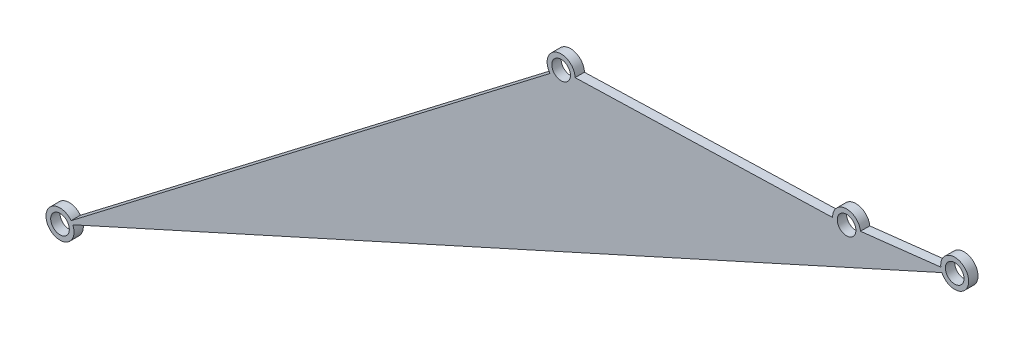
ISO-10303-21;
HEADER;
FILE_DESCRIPTION(('STEP AP214'),'2;1');
FILE_NAME('part.step','',(''),(''),'','','');
FILE_SCHEMA(('AUTOMOTIVE_DESIGN { 1 0 10303 214 1 1 1 1 }'));
ENDSEC;
DATA;
#1=APPLICATION_CONTEXT('core data for automotive mechanical design processes');
#2=APPLICATION_PROTOCOL_DEFINITION('international standard','automotive_design',2000,#1);
#3=PRODUCT_CONTEXT('',#1,'mechanical');
#4=PRODUCT('Part','Part','',(#3));
#5=PRODUCT_RELATED_PRODUCT_CATEGORY('part','',(#4));
#6=PRODUCT_DEFINITION_FORMATION('','',#4);
#7=PRODUCT_DEFINITION_CONTEXT('part definition',#1,'design');
#8=PRODUCT_DEFINITION('design','',#6,#7);
#9=PRODUCT_DEFINITION_SHAPE('','',#8);
#10=(LENGTH_UNIT() NAMED_UNIT(*) SI_UNIT(.MILLI.,.METRE.));
#11=(NAMED_UNIT(*) PLANE_ANGLE_UNIT() SI_UNIT($,.RADIAN.));
#12=(NAMED_UNIT(*) SI_UNIT($,.STERADIAN.) SOLID_ANGLE_UNIT());
#13=UNCERTAINTY_MEASURE_WITH_UNIT(LENGTH_MEASURE(1.E-05),#10,'distance_accuracy_value','');
#14=(GEOMETRIC_REPRESENTATION_CONTEXT(3) GLOBAL_UNCERTAINTY_ASSIGNED_CONTEXT((#13)) GLOBAL_UNIT_ASSIGNED_CONTEXT((#10,
#11,#12)) REPRESENTATION_CONTEXT('',''));
#15=CARTESIAN_POINT('',(0.,0.,0.));
#16=DIRECTION('',(0.,0.,1.));
#17=DIRECTION('',(1.,0.,0.));
#18=AXIS2_PLACEMENT_3D('',#15,#16,#17);
#19=CARTESIAN_POINT('',(50.8029772281827,18.0824154721674,1.));
#20=DIRECTION('',(0.,0.,1.));
#21=DIRECTION('',(1.,0.,0.));
#22=AXIS2_PLACEMENT_3D('',#19,#20,#21);
#23=PLANE('',#22);
#24=CARTESIAN_POINT('',(39.2074477952529,16.7661339027234,1.));
#25=DIRECTION('',(0.,0.,1.));
#26=DIRECTION('',(1.,0.,0.));
#27=AXIS2_PLACEMENT_3D('',#24,#25,#26);
#28=CIRCLE('',#27,0.999999999999998);
#29=CARTESIAN_POINT('',(40.2074477952529,16.7661339027234,1.));
#30=VERTEX_POINT('',#29);
#31=EDGE_CURVE('E195',#30,#30,#28,.T.);
#32=ORIENTED_EDGE('',*,*,#31,.F.);
#33=EDGE_LOOP('',(#32));
#34=FACE_BOUND('',#33,.T.);
#35=CARTESIAN_POINT('',(-45.1567950935448,-25.3229355339265,1.));
#36=DIRECTION('',(0.,0.,1.));
#37=DIRECTION('',(1.,0.,0.));
#38=AXIS2_PLACEMENT_3D('',#35,#36,#37);
#39=CIRCLE('',#38,0.999999999999998);
#40=CARTESIAN_POINT('',(-44.1567950935448,-25.3229355339265,1.));
#41=VERTEX_POINT('',#40);
#42=EDGE_CURVE('E141',#41,#41,#39,.T.);
#43=ORIENTED_EDGE('',*,*,#42,.F.);
#44=EDGE_LOOP('',(#43));
#45=FACE_BOUND('',#44,.T.);
#46=CARTESIAN_POINT('',(50.8029772281827,18.0824154721674,1.));
#47=DIRECTION('',(0.,0.,1.));
#48=DIRECTION('',(1.,0.,0.));
#49=AXIS2_PLACEMENT_3D('',#46,#47,#48);
#50=CIRCLE('',#49,1.50000000000001);
#51=CARTESIAN_POINT('',(49.4362884845197,17.4642230442417,1.));
#52=VERTEX_POINT('',#51);
#53=CARTESIAN_POINT('',(49.3125492805054,17.913227609771,1.));
#54=VERTEX_POINT('',#53);
#55=EDGE_CURVE('E152',#52,#54,#50,.T.);
#56=ORIENTED_EDGE('',*,*,#55,.T.);
#57=DIRECTION('',(-0.993618631784904,-0.112791908264269,0.));
#58=VECTOR('',#57,1.);
#59=CARTESIAN_POINT('',(40.6978757429303,16.9353217651198,1.));
#60=LINE('',#59,#58);
#61=CARTESIAN_POINT('',(40.6978757429303,16.9353217651198,1.));
#62=VERTEX_POINT('',#61);
#63=EDGE_CURVE('E100',#54,#62,#60,.T.);
#64=ORIENTED_EDGE('',*,*,#63,.T.);
#65=CARTESIAN_POINT('',(39.2074477952529,16.7661339027234,1.));
#66=DIRECTION('',(0.,0.,1.));
#67=DIRECTION('',(1.,0.,0.));
#68=AXIS2_PLACEMENT_3D('',#65,#66,#67);
#69=CIRCLE('',#68,1.50000000000001);
#70=CARTESIAN_POINT('',(37.708107977388,16.7216354694385,1.));
#71=VERTEX_POINT('',#70);
#72=EDGE_CURVE('E167',#62,#71,#69,.T.);
#73=ORIENTED_EDGE('',*,*,#72,.T.);
#74=DIRECTION('',(-0.999559878576607,-0.029665622189961,0.));
#75=VECTOR('',#74,1.);
#76=CARTESIAN_POINT('',(10.0902685323163,15.9019743283298,1.));
#77=LINE('',#76,#75);
#78=CARTESIAN_POINT('',(10.0902685323163,15.9019743283298,1.));
#79=VERTEX_POINT('',#78);
#80=EDGE_CURVE('E180',#71,#79,#77,.T.);
#81=ORIENTED_EDGE('',*,*,#80,.T.);
#82=CARTESIAN_POINT('',(8.59092871445141,15.8574758950449,1.));
#83=DIRECTION('',(0.,0.,1.));
#84=DIRECTION('',(1.,0.,0.));
#85=AXIS2_PLACEMENT_3D('',#82,#83,#84);
#86=CIRCLE('',#85,1.50000000000001);
#87=CARTESIAN_POINT('',(7.40023921936952,14.9451938518688,1.));
#88=VERTEX_POINT('',#87);
#89=EDGE_CURVE('E119',#79,#88,#86,.T.);
#90=ORIENTED_EDGE('',*,*,#89,.T.);
#91=DIRECTION('',(-0.793792996721256,-0.6081880287841,0.));
#92=VECTOR('',#91,1.);
#93=CARTESIAN_POINT('',(-43.9661055984629,-24.4106534907503,1.));
#94=LINE('',#93,#92);
#95=CARTESIAN_POINT('',(-43.9661055984629,-24.4106534907503,1.));
#96=VERTEX_POINT('',#95);
#97=EDGE_CURVE('E113',#88,#96,#94,.T.);
#98=ORIENTED_EDGE('',*,*,#97,.T.);
#99=CARTESIAN_POINT('',(-45.1567950935448,-25.3229355339265,1.));
#100=DIRECTION('',(0.,0.,1.));
#101=DIRECTION('',(1.,0.,0.));
#102=AXIS2_PLACEMENT_3D('',#99,#100,#101);
#103=CIRCLE('',#102,1.50000000000001);
#104=CARTESIAN_POINT('',(-43.7901063498818,-24.7047431060007,1.));
#105=VERTEX_POINT('',#104);
#106=EDGE_CURVE('E117',#96,#105,#103,.T.);
#107=ORIENTED_EDGE('',*,*,#106,.T.);
#108=DIRECTION('',(0.911125829108693,0.412128285283839,0.));
#109=VECTOR('',#108,1.);
#110=CARTESIAN_POINT('',(49.4362884845197,17.4642230442417,1.));
#111=LINE('',#110,#109);
#112=EDGE_CURVE('E57',#105,#52,#111,.T.);
#113=ORIENTED_EDGE('',*,*,#112,.T.);
#114=EDGE_LOOP('',(#56,#64,#73,#81,#90,#98,#107,#113));
#115=FACE_BOUND('',#114,.T.);
#116=CARTESIAN_POINT('',(8.59092871445141,15.8574758950449,1.));
#117=DIRECTION('',(0.,0.,1.));
#118=DIRECTION('',(1.,0.,0.));
#119=AXIS2_PLACEMENT_3D('',#116,#117,#118);
#120=CIRCLE('',#119,1.);
#121=CARTESIAN_POINT('',(9.59092871445141,15.8574758950449,1.));
#122=VERTEX_POINT('',#121);
#123=EDGE_CURVE('E189',#122,#122,#120,.T.);
#124=ORIENTED_EDGE('',*,*,#123,.F.);
#125=EDGE_LOOP('',(#124));
#126=FACE_BOUND('',#125,.T.);
#127=CARTESIAN_POINT('',(50.8029772281827,18.0824154721674,1.));
#128=DIRECTION('',(0.,0.,1.));
#129=DIRECTION('',(1.,0.,0.));
#130=AXIS2_PLACEMENT_3D('',#127,#128,#129);
#131=CIRCLE('',#130,0.999999999999998);
#132=CARTESIAN_POINT('',(51.8029772281827,18.0824154721674,1.));
#133=VERTEX_POINT('',#132);
#134=EDGE_CURVE('E201',#133,#133,#131,.T.);
#135=ORIENTED_EDGE('',*,*,#134,.F.);
#136=EDGE_LOOP('',(#135));
#137=FACE_BOUND('',#136,.T.);
#138=ADVANCED_FACE('F40',(#34,#45,#115,#126,#137),#23,.T.);
#139=CARTESIAN_POINT('',(50.8029772281827,18.0824154721674,0.));
#140=DIRECTION('',(0.,0.,1.));
#141=DIRECTION('',(1.,0.,0.));
#142=AXIS2_PLACEMENT_3D('',#139,#140,#141);
#143=PLANE('',#142);
#144=CARTESIAN_POINT('',(50.8029772281827,18.0824154721674,0.));
#145=DIRECTION('',(0.,0.,1.));
#146=DIRECTION('',(1.,0.,0.));
#147=AXIS2_PLACEMENT_3D('',#144,#145,#146);
#148=CIRCLE('',#147,1.50000000000001);
#149=CARTESIAN_POINT('',(49.4362884845197,17.4642230442417,0.));
#150=VERTEX_POINT('',#149);
#151=CARTESIAN_POINT('',(49.3125492805054,17.913227609771,0.));
#152=VERTEX_POINT('',#151);
#153=EDGE_CURVE('E137',#150,#152,#148,.T.);
#154=ORIENTED_EDGE('',*,*,#153,.F.);
#155=DIRECTION('',(0.911125829108693,0.412128285283839,0.));
#156=VECTOR('',#155,1.);
#157=CARTESIAN_POINT('',(49.4362884845197,17.4642230442417,0.));
#158=LINE('',#157,#156);
#159=CARTESIAN_POINT('',(-43.7901063498818,-24.7047431060007,0.));
#160=VERTEX_POINT('',#159);
#161=EDGE_CURVE('E92',#160,#150,#158,.T.);
#162=ORIENTED_EDGE('',*,*,#161,.F.);
#163=CARTESIAN_POINT('',(-45.1567950935448,-25.3229355339265,0.));
#164=DIRECTION('',(0.,0.,1.));
#165=DIRECTION('',(1.,0.,0.));
#166=AXIS2_PLACEMENT_3D('',#163,#164,#165);
#167=CIRCLE('',#166,1.50000000000001);
#168=CARTESIAN_POINT('',(-43.9661055984629,-24.4106534907503,0.));
#169=VERTEX_POINT('',#168);
#170=EDGE_CURVE('E86',#169,#160,#167,.T.);
#171=ORIENTED_EDGE('',*,*,#170,.F.);
#172=DIRECTION('',(-0.793792996721256,-0.6081880287841,0.));
#173=VECTOR('',#172,1.);
#174=CARTESIAN_POINT('',(-43.9661055984629,-24.4106534907503,0.));
#175=LINE('',#174,#173);
#176=CARTESIAN_POINT('',(7.40023921936952,14.9451938518688,0.));
#177=VERTEX_POINT('',#176);
#178=EDGE_CURVE('E127',#177,#169,#175,.T.);
#179=ORIENTED_EDGE('',*,*,#178,.F.);
#180=CARTESIAN_POINT('',(8.59092871445141,15.8574758950449,0.));
#181=DIRECTION('',(0.,0.,1.));
#182=DIRECTION('',(1.,0.,0.));
#183=AXIS2_PLACEMENT_3D('',#180,#181,#182);
#184=CIRCLE('',#183,1.50000000000001);
#185=CARTESIAN_POINT('',(10.0902685323163,15.9019743283298,0.));
#186=VERTEX_POINT('',#185);
#187=EDGE_CURVE('E147',#186,#177,#184,.T.);
#188=ORIENTED_EDGE('',*,*,#187,.F.);
#189=DIRECTION('',(-0.999559878576607,-0.029665622189961,0.));
#190=VECTOR('',#189,1.);
#191=CARTESIAN_POINT('',(10.0902685323163,15.9019743283298,0.));
#192=LINE('',#191,#190);
#193=CARTESIAN_POINT('',(37.708107977388,16.7216354694385,0.));
#194=VERTEX_POINT('',#193);
#195=EDGE_CURVE('E145',#194,#186,#192,.T.);
#196=ORIENTED_EDGE('',*,*,#195,.F.);
#197=CARTESIAN_POINT('',(39.2074477952529,16.7661339027234,0.));
#198=DIRECTION('',(0.,0.,1.));
#199=DIRECTION('',(1.,0.,0.));
#200=AXIS2_PLACEMENT_3D('',#197,#198,#199);
#201=CIRCLE('',#200,1.50000000000001);
#202=CARTESIAN_POINT('',(40.6978757429303,16.9353217651198,0.));
#203=VERTEX_POINT('',#202);
#204=EDGE_CURVE('E143',#203,#194,#201,.T.);
#205=ORIENTED_EDGE('',*,*,#204,.F.);
#206=DIRECTION('',(-0.993618631784904,-0.112791908264269,0.));
#207=VECTOR('',#206,1.);
#208=CARTESIAN_POINT('',(40.6978757429303,16.9353217651198,0.));
#209=LINE('',#208,#207);
#210=EDGE_CURVE('E140',#152,#203,#209,.T.);
#211=ORIENTED_EDGE('',*,*,#210,.F.);
#212=EDGE_LOOP('',(#154,#162,#171,#179,#188,#196,#205,#211));
#213=FACE_BOUND('',#212,.T.);
#214=CARTESIAN_POINT('',(-45.1567950935448,-25.3229355339265,0.));
#215=DIRECTION('',(0.,0.,1.));
#216=DIRECTION('',(1.,0.,0.));
#217=AXIS2_PLACEMENT_3D('',#214,#215,#216);
#218=CIRCLE('',#217,0.999999999999998);
#219=CARTESIAN_POINT('',(-44.1567950935448,-25.3229355339265,0.));
#220=VERTEX_POINT('',#219);
#221=EDGE_CURVE('E186',#220,#220,#218,.T.);
#222=ORIENTED_EDGE('',*,*,#221,.T.);
#223=EDGE_LOOP('',(#222));
#224=FACE_BOUND('',#223,.T.);
#225=CARTESIAN_POINT('',(8.59092871445141,15.8574758950449,0.));
#226=DIRECTION('',(0.,0.,1.));
#227=DIRECTION('',(1.,0.,0.));
#228=AXIS2_PLACEMENT_3D('',#225,#226,#227);
#229=CIRCLE('',#228,1.);
#230=CARTESIAN_POINT('',(9.59092871445141,15.8574758950449,0.));
#231=VERTEX_POINT('',#230);
#232=EDGE_CURVE('E192',#231,#231,#229,.T.);
#233=ORIENTED_EDGE('',*,*,#232,.T.);
#234=EDGE_LOOP('',(#233));
#235=FACE_BOUND('',#234,.T.);
#236=CARTESIAN_POINT('',(39.2074477952529,16.7661339027234,0.));
#237=DIRECTION('',(0.,0.,1.));
#238=DIRECTION('',(1.,0.,0.));
#239=AXIS2_PLACEMENT_3D('',#236,#237,#238);
#240=CIRCLE('',#239,0.999999999999998);
#241=CARTESIAN_POINT('',(40.2074477952529,16.7661339027234,0.));
#242=VERTEX_POINT('',#241);
#243=EDGE_CURVE('E198',#242,#242,#240,.T.);
#244=ORIENTED_EDGE('',*,*,#243,.T.);
#245=EDGE_LOOP('',(#244));
#246=FACE_BOUND('',#245,.T.);
#247=CARTESIAN_POINT('',(50.8029772281827,18.0824154721674,0.));
#248=DIRECTION('',(0.,0.,1.));
#249=DIRECTION('',(1.,0.,0.));
#250=AXIS2_PLACEMENT_3D('',#247,#248,#249);
#251=CIRCLE('',#250,0.999999999999998);
#252=CARTESIAN_POINT('',(51.8029772281827,18.0824154721674,0.));
#253=VERTEX_POINT('',#252);
#254=EDGE_CURVE('E204',#253,#253,#251,.T.);
#255=ORIENTED_EDGE('',*,*,#254,.T.);
#256=EDGE_LOOP('',(#255));
#257=FACE_BOUND('',#256,.T.);
#258=ADVANCED_FACE('F171',(#213,#224,#235,#246,#257),#143,.F.);
#259=CARTESIAN_POINT('',(50.8029772281827,18.0824154721674,1.));
#260=DIRECTION('',(0.,0.,-1.));
#261=DIRECTION('',(-1.,0.,0.));
#262=AXIS2_PLACEMENT_3D('',#259,#260,#261);
#263=CYLINDRICAL_SURFACE('',#262,1.50000000000001);
#264=ORIENTED_EDGE('',*,*,#153,.T.);
#265=DIRECTION('',(0.,0.,-1.));
#266=VECTOR('',#265,1.);
#267=CARTESIAN_POINT('',(49.3125492805054,17.913227609771,1.));
#268=LINE('',#267,#266);
#269=EDGE_CURVE('E11',#54,#152,#268,.T.);
#270=ORIENTED_EDGE('',*,*,#269,.F.);
#271=ORIENTED_EDGE('',*,*,#55,.F.);
#272=DIRECTION('',(0.,0.,-1.));
#273=VECTOR('',#272,1.);
#274=CARTESIAN_POINT('',(49.4362884845197,17.4642230442417,1.));
#275=LINE('',#274,#273);
#276=EDGE_CURVE('E133',#52,#150,#275,.T.);
#277=ORIENTED_EDGE('',*,*,#276,.T.);
#278=EDGE_LOOP('',(#264,#270,#271,#277));
#279=FACE_BOUND('',#278,.T.);
#280=ADVANCED_FACE('F42',(#279),#263,.T.);
#281=CARTESIAN_POINT('',(40.6978757429303,16.9353217651198,1.));
#282=DIRECTION('',(0.112791908264269,-0.993618631784904,0.));
#283=DIRECTION('',(0.993618631784904,0.112791908264269,0.));
#284=AXIS2_PLACEMENT_3D('',#281,#282,#283);
#285=PLANE('',#284);
#286=ORIENTED_EDGE('',*,*,#210,.T.);
#287=DIRECTION('',(0.,0.,-1.));
#288=VECTOR('',#287,1.);
#289=CARTESIAN_POINT('',(40.6978757429303,16.9353217651198,1.));
#290=LINE('',#289,#288);
#291=EDGE_CURVE('E49',#62,#203,#290,.T.);
#292=ORIENTED_EDGE('',*,*,#291,.F.);
#293=ORIENTED_EDGE('',*,*,#63,.F.);
#294=ORIENTED_EDGE('',*,*,#269,.T.);
#295=EDGE_LOOP('',(#286,#292,#293,#294));
#296=FACE_BOUND('',#295,.T.);
#297=ADVANCED_FACE('F238',(#296),#285,.F.);
#298=CARTESIAN_POINT('',(39.2074477952529,16.7661339027234,1.));
#299=DIRECTION('',(0.,0.,-1.));
#300=DIRECTION('',(-1.,0.,0.));
#301=AXIS2_PLACEMENT_3D('',#298,#299,#300);
#302=CYLINDRICAL_SURFACE('',#301,1.50000000000001);
#303=ORIENTED_EDGE('',*,*,#204,.T.);
#304=DIRECTION('',(0.,0.,-1.));
#305=VECTOR('',#304,1.);
#306=CARTESIAN_POINT('',(37.708107977388,16.7216354694385,1.));
#307=LINE('',#306,#305);
#308=EDGE_CURVE('E159',#71,#194,#307,.T.);
#309=ORIENTED_EDGE('',*,*,#308,.F.);
#310=ORIENTED_EDGE('',*,*,#72,.F.);
#311=ORIENTED_EDGE('',*,*,#291,.T.);
#312=EDGE_LOOP('',(#303,#309,#310,#311));
#313=FACE_BOUND('',#312,.T.);
#314=ADVANCED_FACE('F165',(#313),#302,.T.);
#315=CARTESIAN_POINT('',(10.0902685323163,15.9019743283298,1.));
#316=DIRECTION('',(0.029665622189961,-0.999559878576608,0.));
#317=DIRECTION('',(0.999559878576608,0.029665622189961,0.));
#318=AXIS2_PLACEMENT_3D('',#315,#316,#317);
#319=PLANE('',#318);
#320=ORIENTED_EDGE('',*,*,#195,.T.);
#321=DIRECTION('',(0.,0.,-1.));
#322=VECTOR('',#321,1.);
#323=CARTESIAN_POINT('',(10.0902685323163,15.9019743283298,1.));
#324=LINE('',#323,#322);
#325=EDGE_CURVE('E156',#79,#186,#324,.T.);
#326=ORIENTED_EDGE('',*,*,#325,.F.);
#327=ORIENTED_EDGE('',*,*,#80,.F.);
#328=ORIENTED_EDGE('',*,*,#308,.T.);
#329=EDGE_LOOP('',(#320,#326,#327,#328));
#330=FACE_BOUND('',#329,.T.);
#331=ADVANCED_FACE('F176',(#330),#319,.F.);
#332=CARTESIAN_POINT('',(8.59092871445141,15.8574758950449,1.));
#333=DIRECTION('',(0.,0.,-1.));
#334=DIRECTION('',(-1.,0.,0.));
#335=AXIS2_PLACEMENT_3D('',#332,#333,#334);
#336=CYLINDRICAL_SURFACE('',#335,1.50000000000001);
#337=ORIENTED_EDGE('',*,*,#187,.T.);
#338=DIRECTION('',(0.,0.,-1.));
#339=VECTOR('',#338,1.);
#340=CARTESIAN_POINT('',(7.40023921936952,14.9451938518688,1.));
#341=LINE('',#340,#339);
#342=EDGE_CURVE('E128',#88,#177,#341,.T.);
#343=ORIENTED_EDGE('',*,*,#342,.F.);
#344=ORIENTED_EDGE('',*,*,#89,.F.);
#345=ORIENTED_EDGE('',*,*,#325,.T.);
#346=EDGE_LOOP('',(#337,#343,#344,#345));
#347=FACE_BOUND('',#346,.T.);
#348=ADVANCED_FACE('F179',(#347),#336,.T.);
#349=CARTESIAN_POINT('',(-43.9661055984629,-24.4106534907503,1.));
#350=DIRECTION('',(0.608188028784099,-0.793792996721256,0.));
#351=DIRECTION('',(0.793792996721256,0.608188028784099,0.));
#352=AXIS2_PLACEMENT_3D('',#349,#350,#351);
#353=PLANE('',#352);
#354=ORIENTED_EDGE('',*,*,#178,.T.);
#355=DIRECTION('',(0.,0.,-1.));
#356=VECTOR('',#355,1.);
#357=CARTESIAN_POINT('',(-43.9661055984629,-24.4106534907503,1.));
#358=LINE('',#357,#356);
#359=EDGE_CURVE('E124',#96,#169,#358,.T.);
#360=ORIENTED_EDGE('',*,*,#359,.F.);
#361=ORIENTED_EDGE('',*,*,#97,.F.);
#362=ORIENTED_EDGE('',*,*,#342,.T.);
#363=EDGE_LOOP('',(#354,#360,#361,#362));
#364=FACE_BOUND('',#363,.T.);
#365=ADVANCED_FACE('F125',(#364),#353,.F.);
#366=CARTESIAN_POINT('',(-45.1567950935448,-25.3229355339265,1.));
#367=DIRECTION('',(0.,0.,-1.));
#368=DIRECTION('',(-1.,0.,0.));
#369=AXIS2_PLACEMENT_3D('',#366,#367,#368);
#370=CYLINDRICAL_SURFACE('',#369,1.50000000000001);
#371=ORIENTED_EDGE('',*,*,#170,.T.);
#372=DIRECTION('',(0.,0.,-1.));
#373=VECTOR('',#372,1.);
#374=CARTESIAN_POINT('',(-43.7901063498818,-24.7047431060007,1.));
#375=LINE('',#374,#373);
#376=EDGE_CURVE('E129',#105,#160,#375,.T.);
#377=ORIENTED_EDGE('',*,*,#376,.F.);
#378=ORIENTED_EDGE('',*,*,#106,.F.);
#379=ORIENTED_EDGE('',*,*,#359,.T.);
#380=EDGE_LOOP('',(#371,#377,#378,#379));
#381=FACE_BOUND('',#380,.T.);
#382=ADVANCED_FACE('F131',(#381),#370,.T.);
#383=CARTESIAN_POINT('',(49.4362884845197,17.4642230442417,1.));
#384=DIRECTION('',(-0.412128285283839,0.911125829108693,0.));
#385=DIRECTION('',(-0.911125829108693,-0.412128285283839,0.));
#386=AXIS2_PLACEMENT_3D('',#383,#384,#385);
#387=PLANE('',#386);
#388=ORIENTED_EDGE('',*,*,#161,.T.);
#389=ORIENTED_EDGE('',*,*,#276,.F.);
#390=ORIENTED_EDGE('',*,*,#112,.F.);
#391=ORIENTED_EDGE('',*,*,#376,.T.);
#392=EDGE_LOOP('',(#388,#389,#390,#391));
#393=FACE_BOUND('',#392,.T.);
#394=ADVANCED_FACE('F226',(#393),#387,.F.);
#395=CARTESIAN_POINT('',(-45.1567950935448,-25.3229355339265,1.));
#396=DIRECTION('',(0.,0.,-1.));
#397=DIRECTION('',(-1.,0.,0.));
#398=AXIS2_PLACEMENT_3D('',#395,#396,#397);
#399=CYLINDRICAL_SURFACE('',#398,0.999999999999998);
#400=ORIENTED_EDGE('',*,*,#42,.T.);
#401=EDGE_LOOP('',(#400));
#402=FACE_BOUND('',#401,.T.);
#403=ORIENTED_EDGE('',*,*,#221,.F.);
#404=EDGE_LOOP('',(#403));
#405=FACE_BOUND('',#404,.T.);
#406=ADVANCED_FACE('F223',(#402,#405),#399,.F.);
#407=CARTESIAN_POINT('',(8.59092871445141,15.8574758950449,1.));
#408=DIRECTION('',(0.,0.,-1.));
#409=DIRECTION('',(-1.,0.,0.));
#410=AXIS2_PLACEMENT_3D('',#407,#408,#409);
#411=CYLINDRICAL_SURFACE('',#410,1.);
#412=ORIENTED_EDGE('',*,*,#123,.T.);
#413=EDGE_LOOP('',(#412));
#414=FACE_BOUND('',#413,.T.);
#415=ORIENTED_EDGE('',*,*,#232,.F.);
#416=EDGE_LOOP('',(#415));
#417=FACE_BOUND('',#416,.T.);
#418=ADVANCED_FACE('F316',(#414,#417),#411,.F.);
#419=CARTESIAN_POINT('',(39.2074477952529,16.7661339027234,1.));
#420=DIRECTION('',(0.,0.,-1.));
#421=DIRECTION('',(-1.,0.,0.));
#422=AXIS2_PLACEMENT_3D('',#419,#420,#421);
#423=CYLINDRICAL_SURFACE('',#422,0.999999999999998);
#424=ORIENTED_EDGE('',*,*,#31,.T.);
#425=EDGE_LOOP('',(#424));
#426=FACE_BOUND('',#425,.T.);
#427=ORIENTED_EDGE('',*,*,#243,.F.);
#428=EDGE_LOOP('',(#427));
#429=FACE_BOUND('',#428,.T.);
#430=ADVANCED_FACE('F325',(#426,#429),#423,.F.);
#431=CARTESIAN_POINT('',(50.8029772281827,18.0824154721674,1.));
#432=DIRECTION('',(0.,0.,-1.));
#433=DIRECTION('',(-1.,0.,0.));
#434=AXIS2_PLACEMENT_3D('',#431,#432,#433);
#435=CYLINDRICAL_SURFACE('',#434,0.999999999999998);
#436=ORIENTED_EDGE('',*,*,#134,.T.);
#437=EDGE_LOOP('',(#436));
#438=FACE_BOUND('',#437,.T.);
#439=ORIENTED_EDGE('',*,*,#254,.F.);
#440=EDGE_LOOP('',(#439));
#441=FACE_BOUND('',#440,.T.);
#442=ADVANCED_FACE('F210',(#438,#441),#435,.F.);
#443=CLOSED_SHELL('',(#138,#258,#280,#297,#314,#331,#348,#365,#382,#394,#406,#418,#430,#442));
#444=MANIFOLD_SOLID_BREP('B2',#443);
#445=ADVANCED_BREP_SHAPE_REPRESENTATION('',(#18,#444),#14);
#446=SHAPE_DEFINITION_REPRESENTATION(#9,#445);
ENDSEC;
END-ISO-10303-21;
